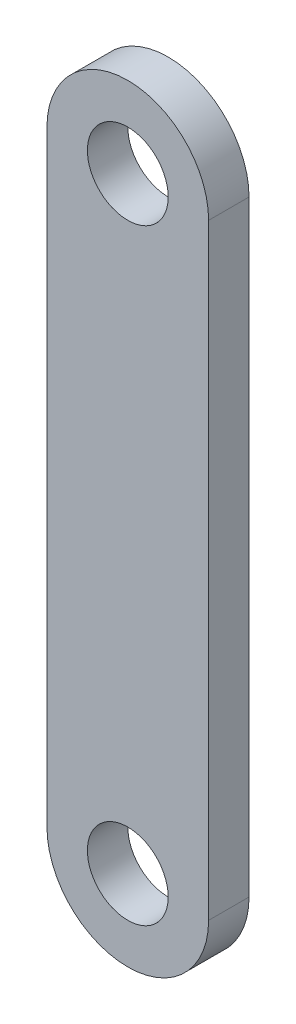
ISO-10303-21;
HEADER;
FILE_DESCRIPTION(('STEP AP214'),'2;1');
FILE_NAME('part.step','',(''),(''),'','','');
FILE_SCHEMA(('AUTOMOTIVE_DESIGN { 1 0 10303 214 1 1 1 1 }'));
ENDSEC;
DATA;
#1=APPLICATION_CONTEXT('core data for automotive mechanical design processes');
#2=APPLICATION_PROTOCOL_DEFINITION('international standard','automotive_design',2000,#1);
#3=PRODUCT_CONTEXT('',#1,'mechanical');
#4=PRODUCT('Part','Part','',(#3));
#5=PRODUCT_RELATED_PRODUCT_CATEGORY('part','',(#4));
#6=PRODUCT_DEFINITION_FORMATION('','',#4);
#7=PRODUCT_DEFINITION_CONTEXT('part definition',#1,'design');
#8=PRODUCT_DEFINITION('design','',#6,#7);
#9=PRODUCT_DEFINITION_SHAPE('','',#8);
#10=(LENGTH_UNIT() NAMED_UNIT(*) SI_UNIT(.MILLI.,.METRE.));
#11=(NAMED_UNIT(*) PLANE_ANGLE_UNIT() SI_UNIT($,.RADIAN.));
#12=(NAMED_UNIT(*) SI_UNIT($,.STERADIAN.) SOLID_ANGLE_UNIT());
#13=UNCERTAINTY_MEASURE_WITH_UNIT(LENGTH_MEASURE(1.E-05),#10,'distance_accuracy_value','');
#14=(GEOMETRIC_REPRESENTATION_CONTEXT(3) GLOBAL_UNCERTAINTY_ASSIGNED_CONTEXT((#13)) GLOBAL_UNIT_ASSIGNED_CONTEXT((#10,
#11,#12)) REPRESENTATION_CONTEXT('',''));
#15=CARTESIAN_POINT('',(0.,0.,0.));
#16=DIRECTION('',(0.,0.,1.));
#17=DIRECTION('',(1.,0.,0.));
#18=AXIS2_PLACEMENT_3D('',#15,#16,#17);
#19=CARTESIAN_POINT('',(0.,-9.525,1.27));
#20=DIRECTION('',(0.,0.,-1.));
#21=DIRECTION('',(-1.,0.,0.));
#22=AXIS2_PLACEMENT_3D('',#19,#20,#21);
#23=CYLINDRICAL_SURFACE('',#22,2.54);
#24=CARTESIAN_POINT('',(0.,-9.525,0.));
#25=DIRECTION('',(0.,0.,1.));
#26=DIRECTION('',(1.,0.,0.));
#27=AXIS2_PLACEMENT_3D('',#24,#25,#26);
#28=CIRCLE('',#27,2.54);
#29=CARTESIAN_POINT('',(-2.54,-9.525,0.));
#30=VERTEX_POINT('',#29);
#31=CARTESIAN_POINT('',(2.54,-9.525,0.));
#32=VERTEX_POINT('',#31);
#33=EDGE_CURVE('E99',#30,#32,#28,.T.);
#34=ORIENTED_EDGE('',*,*,#33,.T.);
#35=DIRECTION('',(0.,0.,-1.));
#36=VECTOR('',#35,1.);
#37=CARTESIAN_POINT('',(2.54,-9.525,1.27));
#38=LINE('',#37,#36);
#39=CARTESIAN_POINT('',(2.54,-9.525,1.27));
#40=VERTEX_POINT('',#39);
#41=EDGE_CURVE('E11',#40,#32,#38,.T.);
#42=ORIENTED_EDGE('',*,*,#41,.F.);
#43=CARTESIAN_POINT('',(0.,-9.525,1.27));
#44=DIRECTION('',(0.,0.,1.));
#45=DIRECTION('',(1.,0.,0.));
#46=AXIS2_PLACEMENT_3D('',#43,#44,#45);
#47=CIRCLE('',#46,2.54);
#48=CARTESIAN_POINT('',(-2.54,-9.525,1.27));
#49=VERTEX_POINT('',#48);
#50=EDGE_CURVE('E86',#49,#40,#47,.T.);
#51=ORIENTED_EDGE('',*,*,#50,.F.);
#52=DIRECTION('',(0.,0.,-1.));
#53=VECTOR('',#52,1.);
#54=CARTESIAN_POINT('',(-2.54,-9.525,1.27));
#55=LINE('',#54,#53);
#56=EDGE_CURVE('E95',#49,#30,#55,.T.);
#57=ORIENTED_EDGE('',*,*,#56,.T.);
#58=EDGE_LOOP('',(#34,#42,#51,#57));
#59=FACE_BOUND('',#58,.T.);
#60=ADVANCED_FACE('F33',(#59),#23,.T.);
#61=CARTESIAN_POINT('',(2.54,-9.525,1.27));
#62=DIRECTION('',(-1.,0.,0.));
#63=DIRECTION('',(0.,-1.,0.));
#64=AXIS2_PLACEMENT_3D('',#61,#62,#63);
#65=PLANE('',#64);
#66=DIRECTION('',(0.,1.,0.));
#67=VECTOR('',#66,1.);
#68=CARTESIAN_POINT('',(2.54,-9.525,0.));
#69=LINE('',#68,#67);
#70=CARTESIAN_POINT('',(2.54,9.525,0.));
#71=VERTEX_POINT('',#70);
#72=EDGE_CURVE('E90',#32,#71,#69,.T.);
#73=ORIENTED_EDGE('',*,*,#72,.T.);
#74=DIRECTION('',(0.,0.,-1.));
#75=VECTOR('',#74,1.);
#76=CARTESIAN_POINT('',(2.54,9.525,1.27));
#77=LINE('',#76,#75);
#78=CARTESIAN_POINT('',(2.54,9.525,1.27));
#79=VERTEX_POINT('',#78);
#80=EDGE_CURVE('E42',#79,#71,#77,.T.);
#81=ORIENTED_EDGE('',*,*,#80,.F.);
#82=DIRECTION('',(0.,1.,0.));
#83=VECTOR('',#82,1.);
#84=CARTESIAN_POINT('',(2.54,-9.525,1.27));
#85=LINE('',#84,#83);
#86=EDGE_CURVE('E81',#40,#79,#85,.T.);
#87=ORIENTED_EDGE('',*,*,#86,.F.);
#88=ORIENTED_EDGE('',*,*,#41,.T.);
#89=EDGE_LOOP('',(#73,#81,#87,#88));
#90=FACE_BOUND('',#89,.T.);
#91=ADVANCED_FACE('F89',(#90),#65,.F.);
#92=CARTESIAN_POINT('',(0.,9.525,1.27));
#93=DIRECTION('',(0.,0.,-1.));
#94=DIRECTION('',(-1.,0.,0.));
#95=AXIS2_PLACEMENT_3D('',#92,#93,#94);
#96=CYLINDRICAL_SURFACE('',#95,2.54);
#97=CARTESIAN_POINT('',(0.,9.525,0.));
#98=DIRECTION('',(0.,0.,1.));
#99=DIRECTION('',(1.,0.,0.));
#100=AXIS2_PLACEMENT_3D('',#97,#98,#99);
#101=CIRCLE('',#100,2.54);
#102=CARTESIAN_POINT('',(-2.54000000000001,9.525,0.));
#103=VERTEX_POINT('',#102);
#104=EDGE_CURVE('E68',#71,#103,#101,.T.);
#105=ORIENTED_EDGE('',*,*,#104,.T.);
#106=DIRECTION('',(0.,0.,-1.));
#107=VECTOR('',#106,1.);
#108=CARTESIAN_POINT('',(-2.54000000000001,9.525,1.27));
#109=LINE('',#108,#107);
#110=CARTESIAN_POINT('',(-2.54000000000001,9.525,1.27));
#111=VERTEX_POINT('',#110);
#112=EDGE_CURVE('E91',#111,#103,#109,.T.);
#113=ORIENTED_EDGE('',*,*,#112,.F.);
#114=CARTESIAN_POINT('',(0.,9.525,1.27));
#115=DIRECTION('',(0.,0.,1.));
#116=DIRECTION('',(1.,0.,0.));
#117=AXIS2_PLACEMENT_3D('',#114,#115,#116);
#118=CIRCLE('',#117,2.54);
#119=EDGE_CURVE('E84',#79,#111,#118,.T.);
#120=ORIENTED_EDGE('',*,*,#119,.F.);
#121=ORIENTED_EDGE('',*,*,#80,.T.);
#122=EDGE_LOOP('',(#105,#113,#120,#121));
#123=FACE_BOUND('',#122,.T.);
#124=ADVANCED_FACE('F93',(#123),#96,.T.);
#125=CARTESIAN_POINT('',(-2.54,-9.525,1.27));
#126=DIRECTION('',(1.,0.,0.));
#127=DIRECTION('',(0.,1.,0.));
#128=AXIS2_PLACEMENT_3D('',#125,#126,#127);
#129=PLANE('',#128);
#130=DIRECTION('',(0.,-1.,0.));
#131=VECTOR('',#130,1.);
#132=CARTESIAN_POINT('',(-2.54,-9.525,0.));
#133=LINE('',#132,#131);
#134=EDGE_CURVE('E74',#103,#30,#133,.T.);
#135=ORIENTED_EDGE('',*,*,#134,.T.);
#136=ORIENTED_EDGE('',*,*,#56,.F.);
#137=DIRECTION('',(0.,-1.,0.));
#138=VECTOR('',#137,1.);
#139=CARTESIAN_POINT('',(-2.54,-9.525,1.27));
#140=LINE('',#139,#138);
#141=EDGE_CURVE('E51',#111,#49,#140,.T.);
#142=ORIENTED_EDGE('',*,*,#141,.F.);
#143=ORIENTED_EDGE('',*,*,#112,.T.);
#144=EDGE_LOOP('',(#135,#136,#142,#143));
#145=FACE_BOUND('',#144,.T.);
#146=ADVANCED_FACE('F127',(#145),#129,.F.);
#147=CARTESIAN_POINT('',(0.,-9.525,1.27));
#148=DIRECTION('',(0.,0.,1.));
#149=DIRECTION('',(1.,0.,0.));
#150=AXIS2_PLACEMENT_3D('',#147,#148,#149);
#151=PLANE('',#150);
#152=CARTESIAN_POINT('',(0.,-9.525,1.27));
#153=DIRECTION('',(0.,0.,1.));
#154=DIRECTION('',(1.,0.,0.));
#155=AXIS2_PLACEMENT_3D('',#152,#153,#154);
#156=CIRCLE('',#155,1.27);
#157=CARTESIAN_POINT('',(1.27,-9.525,1.27));
#158=VERTEX_POINT('',#157);
#159=EDGE_CURVE('E116',#158,#158,#156,.T.);
#160=ORIENTED_EDGE('',*,*,#159,.F.);
#161=EDGE_LOOP('',(#160));
#162=FACE_BOUND('',#161,.T.);
#163=CARTESIAN_POINT('',(0.,9.525,1.27));
#164=DIRECTION('',(0.,0.,1.));
#165=DIRECTION('',(1.,0.,0.));
#166=AXIS2_PLACEMENT_3D('',#163,#164,#165);
#167=CIRCLE('',#166,1.27);
#168=CARTESIAN_POINT('',(1.27,9.525,1.27));
#169=VERTEX_POINT('',#168);
#170=EDGE_CURVE('E108',#169,#169,#167,.T.);
#171=ORIENTED_EDGE('',*,*,#170,.F.);
#172=EDGE_LOOP('',(#171));
#173=FACE_BOUND('',#172,.T.);
#174=ORIENTED_EDGE('',*,*,#50,.T.);
#175=ORIENTED_EDGE('',*,*,#86,.T.);
#176=ORIENTED_EDGE('',*,*,#119,.T.);
#177=ORIENTED_EDGE('',*,*,#141,.T.);
#178=EDGE_LOOP('',(#174,#175,#176,#177));
#179=FACE_BOUND('',#178,.T.);
#180=ADVANCED_FACE('F82',(#162,#173,#179),#151,.T.);
#181=CARTESIAN_POINT('',(0.,-9.525,0.));
#182=DIRECTION('',(0.,0.,1.));
#183=DIRECTION('',(1.,0.,0.));
#184=AXIS2_PLACEMENT_3D('',#181,#182,#183);
#185=PLANE('',#184);
#186=CARTESIAN_POINT('',(0.,-9.525,0.));
#187=DIRECTION('',(0.,0.,1.));
#188=DIRECTION('',(1.,0.,0.));
#189=AXIS2_PLACEMENT_3D('',#186,#187,#188);
#190=CIRCLE('',#189,1.27);
#191=CARTESIAN_POINT('',(1.27,-9.525,0.));
#192=VERTEX_POINT('',#191);
#193=EDGE_CURVE('E36',#192,#192,#190,.T.);
#194=ORIENTED_EDGE('',*,*,#193,.T.);
#195=EDGE_LOOP('',(#194));
#196=FACE_BOUND('',#195,.T.);
#197=CARTESIAN_POINT('',(0.,9.525,0.));
#198=DIRECTION('',(0.,0.,1.));
#199=DIRECTION('',(1.,0.,0.));
#200=AXIS2_PLACEMENT_3D('',#197,#198,#199);
#201=CIRCLE('',#200,1.27);
#202=CARTESIAN_POINT('',(1.27,9.525,0.));
#203=VERTEX_POINT('',#202);
#204=EDGE_CURVE('E102',#203,#203,#201,.T.);
#205=ORIENTED_EDGE('',*,*,#204,.T.);
#206=EDGE_LOOP('',(#205));
#207=FACE_BOUND('',#206,.T.);
#208=ORIENTED_EDGE('',*,*,#33,.F.);
#209=ORIENTED_EDGE('',*,*,#134,.F.);
#210=ORIENTED_EDGE('',*,*,#104,.F.);
#211=ORIENTED_EDGE('',*,*,#72,.F.);
#212=EDGE_LOOP('',(#208,#209,#210,#211));
#213=FACE_BOUND('',#212,.T.);
#214=ADVANCED_FACE('F126',(#196,#207,#213),#185,.F.);
#215=CARTESIAN_POINT('',(0.,9.525,-1.27));
#216=DIRECTION('',(0.,0.,1.));
#217=DIRECTION('',(1.,0.,0.));
#218=AXIS2_PLACEMENT_3D('',#215,#216,#217);
#219=CYLINDRICAL_SURFACE('',#218,1.27);
#220=ORIENTED_EDGE('',*,*,#170,.T.);
#221=EDGE_LOOP('',(#220));
#222=FACE_BOUND('',#221,.T.);
#223=ORIENTED_EDGE('',*,*,#204,.F.);
#224=EDGE_LOOP('',(#223));
#225=FACE_BOUND('',#224,.T.);
#226=ADVANCED_FACE('F133',(#222,#225),#219,.F.);
#227=CARTESIAN_POINT('',(0.,-9.525,-1.27));
#228=DIRECTION('',(0.,0.,1.));
#229=DIRECTION('',(1.,0.,0.));
#230=AXIS2_PLACEMENT_3D('',#227,#228,#229);
#231=CYLINDRICAL_SURFACE('',#230,1.27);
#232=ORIENTED_EDGE('',*,*,#159,.T.);
#233=EDGE_LOOP('',(#232));
#234=FACE_BOUND('',#233,.T.);
#235=ORIENTED_EDGE('',*,*,#193,.F.);
#236=EDGE_LOOP('',(#235));
#237=FACE_BOUND('',#236,.T.);
#238=ADVANCED_FACE('F121',(#234,#237),#231,.F.);
#239=CLOSED_SHELL('',(#60,#91,#124,#146,#180,#214,#226,#238));
#240=MANIFOLD_SOLID_BREP('B2',#239);
#241=ADVANCED_BREP_SHAPE_REPRESENTATION('',(#18,#240),#14);
#242=SHAPE_DEFINITION_REPRESENTATION(#9,#241);
ENDSEC;
END-ISO-10303-21;
